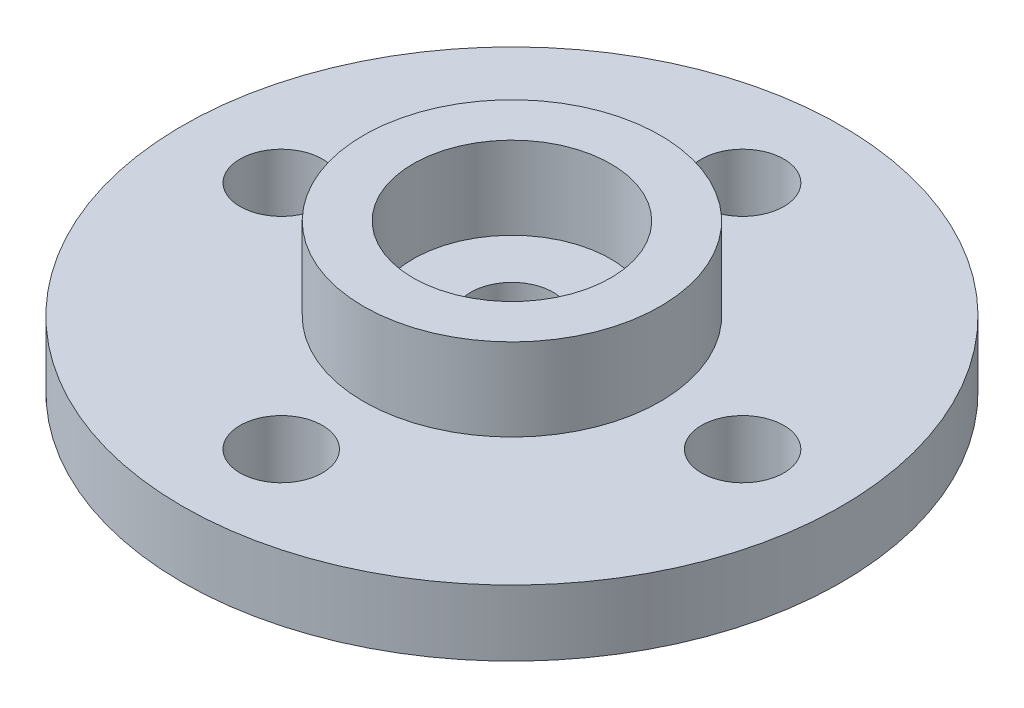
ISO-10303-21;
HEADER;
FILE_DESCRIPTION(('STEP AP214'),'2;1');
FILE_NAME('part.step','',(''),(''),'','','');
FILE_SCHEMA(('AUTOMOTIVE_DESIGN { 1 0 10303 214 1 1 1 1 }'));
ENDSEC;
DATA;
#1=APPLICATION_CONTEXT('core data for automotive mechanical design processes');
#2=APPLICATION_PROTOCOL_DEFINITION('international standard','automotive_design',2000,#1);
#3=PRODUCT_CONTEXT('',#1,'mechanical');
#4=PRODUCT('Part','Part','',(#3));
#5=PRODUCT_RELATED_PRODUCT_CATEGORY('part','',(#4));
#6=PRODUCT_DEFINITION_FORMATION('','',#4);
#7=PRODUCT_DEFINITION_CONTEXT('part definition',#1,'design');
#8=PRODUCT_DEFINITION('design','',#6,#7);
#9=PRODUCT_DEFINITION_SHAPE('','',#8);
#10=(LENGTH_UNIT() NAMED_UNIT(*) SI_UNIT(.MILLI.,.METRE.));
#11=(NAMED_UNIT(*) PLANE_ANGLE_UNIT() SI_UNIT($,.RADIAN.));
#12=(NAMED_UNIT(*) SI_UNIT($,.STERADIAN.) SOLID_ANGLE_UNIT());
#13=UNCERTAINTY_MEASURE_WITH_UNIT(LENGTH_MEASURE(1.E-05),#10,'distance_accuracy_value','');
#14=(GEOMETRIC_REPRESENTATION_CONTEXT(3) GLOBAL_UNCERTAINTY_ASSIGNED_CONTEXT((#13)) GLOBAL_UNIT_ASSIGNED_CONTEXT((#10,
#11,#12)) REPRESENTATION_CONTEXT('',''));
#15=CARTESIAN_POINT('',(0.,0.,0.));
#16=DIRECTION('',(0.,0.,1.));
#17=DIRECTION('',(1.,0.,0.));
#18=AXIS2_PLACEMENT_3D('',#15,#16,#17);
#19=CARTESIAN_POINT('',(0.,2.,0.));
#20=DIRECTION('',(0.,1.,0.));
#21=DIRECTION('',(0.,0.,1.));
#22=AXIS2_PLACEMENT_3D('',#19,#20,#21);
#23=PLANE('',#22);
#24=CARTESIAN_POINT('',(-7.,2.,0.));
#25=DIRECTION('',(0.,1.,0.));
#26=DIRECTION('',(0.,0.,1.));
#27=AXIS2_PLACEMENT_3D('',#24,#25,#26);
#28=CIRCLE('',#27,1.25);
#29=CARTESIAN_POINT('',(-7.,2.,1.24999999999995));
#30=VERTEX_POINT('',#29);
#31=EDGE_CURVE('E65',#30,#30,#28,.T.);
#32=ORIENTED_EDGE('',*,*,#31,.F.);
#33=EDGE_LOOP('',(#32));
#34=FACE_BOUND('',#33,.T.);
#35=CARTESIAN_POINT('',(0.,2.,0.));
#36=DIRECTION('',(0.,1.,0.));
#37=DIRECTION('',(0.,0.,1.));
#38=AXIS2_PLACEMENT_3D('',#35,#36,#37);
#39=CIRCLE('',#38,10.);
#40=CARTESIAN_POINT('',(0.,2.,10.));
#41=VERTEX_POINT('',#40);
#42=EDGE_CURVE('E39',#41,#41,#39,.T.);
#43=ORIENTED_EDGE('',*,*,#42,.T.);
#44=EDGE_LOOP('',(#43));
#45=FACE_BOUND('',#44,.T.);
#46=CARTESIAN_POINT('',(7.,2.,0.));
#47=DIRECTION('',(0.,1.,0.));
#48=DIRECTION('',(0.,0.,1.));
#49=AXIS2_PLACEMENT_3D('',#46,#47,#48);
#50=CIRCLE('',#49,1.25);
#51=CARTESIAN_POINT('',(7.,2.,1.25));
#52=VERTEX_POINT('',#51);
#53=EDGE_CURVE('E48',#52,#52,#50,.T.);
#54=ORIENTED_EDGE('',*,*,#53,.F.);
#55=EDGE_LOOP('',(#54));
#56=FACE_BOUND('',#55,.T.);
#57=CARTESIAN_POINT('',(0.,2.,7.));
#58=DIRECTION('',(0.,1.,0.));
#59=DIRECTION('',(0.,0.,1.));
#60=AXIS2_PLACEMENT_3D('',#57,#58,#59);
#61=CIRCLE('',#60,1.25);
#62=CARTESIAN_POINT('',(0.,2.,8.25));
#63=VERTEX_POINT('',#62);
#64=EDGE_CURVE('E59',#63,#63,#61,.T.);
#65=ORIENTED_EDGE('',*,*,#64,.F.);
#66=EDGE_LOOP('',(#65));
#67=FACE_BOUND('',#66,.T.);
#68=CARTESIAN_POINT('',(0.,2.,-7.));
#69=DIRECTION('',(0.,1.,0.));
#70=DIRECTION('',(0.,0.,1.));
#71=AXIS2_PLACEMENT_3D('',#68,#69,#70);
#72=CIRCLE('',#71,1.25);
#73=CARTESIAN_POINT('',(0.,2.,-5.75));
#74=VERTEX_POINT('',#73);
#75=EDGE_CURVE('E71',#74,#74,#72,.T.);
#76=ORIENTED_EDGE('',*,*,#75,.F.);
#77=EDGE_LOOP('',(#76));
#78=FACE_BOUND('',#77,.T.);
#79=CARTESIAN_POINT('',(0.,2.,0.));
#80=DIRECTION('',(0.,1.,0.));
#81=DIRECTION('',(0.,0.,1.));
#82=AXIS2_PLACEMENT_3D('',#79,#80,#81);
#83=CIRCLE('',#82,4.5);
#84=CARTESIAN_POINT('',(0.,2.,4.5));
#85=VERTEX_POINT('',#84);
#86=EDGE_CURVE('E80',#85,#85,#83,.T.);
#87=ORIENTED_EDGE('',*,*,#86,.F.);
#88=EDGE_LOOP('',(#87));
#89=FACE_BOUND('',#88,.T.);
#90=ADVANCED_FACE('F32',(#34,#45,#56,#67,#78,#89),#23,.T.);
#91=CARTESIAN_POINT('',(0.,2.,0.));
#92=DIRECTION('',(0.,1.,0.));
#93=DIRECTION('',(0.,0.,1.));
#94=AXIS2_PLACEMENT_3D('',#91,#92,#93);
#95=CIRCLE('',#94,3.);
#96=CARTESIAN_POINT('',(0.,2.,3.));
#97=VERTEX_POINT('',#96);
#98=EDGE_CURVE('E10',#97,#97,#95,.F.);
#99=ORIENTED_EDGE('',*,*,#98,.F.);
#100=EDGE_LOOP('',(#99));
#101=FACE_BOUND('',#100,.T.);
#102=CARTESIAN_POINT('',(0.,2.,0.));
#103=DIRECTION('',(0.,1.,0.));
#104=DIRECTION('',(0.,0.,1.));
#105=AXIS2_PLACEMENT_3D('',#102,#103,#104);
#106=CIRCLE('',#105,1.25);
#107=CARTESIAN_POINT('',(0.,2.,1.25));
#108=VERTEX_POINT('',#107);
#109=EDGE_CURVE('E53',#108,#108,#106,.T.);
#110=ORIENTED_EDGE('',*,*,#109,.F.);
#111=EDGE_LOOP('',(#110));
#112=FACE_BOUND('',#111,.T.);
#113=ADVANCED_FACE('F108',(#101,#112),#23,.T.);
#114=CARTESIAN_POINT('',(0.,0.,0.));
#115=DIRECTION('',(0.,1.,0.));
#116=DIRECTION('',(0.,0.,1.));
#117=AXIS2_PLACEMENT_3D('',#114,#115,#116);
#118=PLANE('',#117);
#119=CARTESIAN_POINT('',(-7.,0.,0.));
#120=DIRECTION('',(0.,1.,0.));
#121=DIRECTION('',(0.,0.,1.));
#122=AXIS2_PLACEMENT_3D('',#119,#120,#121);
#123=CIRCLE('',#122,1.25);
#124=CARTESIAN_POINT('',(-7.,0.,1.24999999999995));
#125=VERTEX_POINT('',#124);
#126=EDGE_CURVE('E68',#125,#125,#123,.T.);
#127=ORIENTED_EDGE('',*,*,#126,.T.);
#128=EDGE_LOOP('',(#127));
#129=FACE_BOUND('',#128,.T.);
#130=CARTESIAN_POINT('',(0.,0.,0.));
#131=DIRECTION('',(0.,1.,0.));
#132=DIRECTION('',(0.,0.,1.));
#133=AXIS2_PLACEMENT_3D('',#130,#131,#132);
#134=CIRCLE('',#133,1.25);
#135=CARTESIAN_POINT('',(0.,0.,1.25));
#136=VERTEX_POINT('',#135);
#137=EDGE_CURVE('E56',#136,#136,#134,.T.);
#138=ORIENTED_EDGE('',*,*,#137,.T.);
#139=EDGE_LOOP('',(#138));
#140=FACE_BOUND('',#139,.T.);
#141=CARTESIAN_POINT('',(0.,0.,0.));
#142=DIRECTION('',(0.,1.,0.));
#143=DIRECTION('',(0.,0.,1.));
#144=AXIS2_PLACEMENT_3D('',#141,#142,#143);
#145=CIRCLE('',#144,10.);
#146=CARTESIAN_POINT('',(0.,0.,10.));
#147=VERTEX_POINT('',#146);
#148=EDGE_CURVE('E43',#147,#147,#145,.T.);
#149=ORIENTED_EDGE('',*,*,#148,.F.);
#150=EDGE_LOOP('',(#149));
#151=FACE_BOUND('',#150,.T.);
#152=CARTESIAN_POINT('',(7.,0.,0.));
#153=DIRECTION('',(0.,1.,0.));
#154=DIRECTION('',(0.,0.,1.));
#155=AXIS2_PLACEMENT_3D('',#152,#153,#154);
#156=CIRCLE('',#155,1.25);
#157=CARTESIAN_POINT('',(7.,0.,1.25));
#158=VERTEX_POINT('',#157);
#159=EDGE_CURVE('E50',#158,#158,#156,.T.);
#160=ORIENTED_EDGE('',*,*,#159,.T.);
#161=EDGE_LOOP('',(#160));
#162=FACE_BOUND('',#161,.T.);
#163=CARTESIAN_POINT('',(0.,0.,7.));
#164=DIRECTION('',(0.,1.,0.));
#165=DIRECTION('',(0.,0.,1.));
#166=AXIS2_PLACEMENT_3D('',#163,#164,#165);
#167=CIRCLE('',#166,1.25);
#168=CARTESIAN_POINT('',(0.,0.,8.25));
#169=VERTEX_POINT('',#168);
#170=EDGE_CURVE('E62',#169,#169,#167,.T.);
#171=ORIENTED_EDGE('',*,*,#170,.T.);
#172=EDGE_LOOP('',(#171));
#173=FACE_BOUND('',#172,.T.);
#174=CARTESIAN_POINT('',(0.,0.,-7.));
#175=DIRECTION('',(0.,1.,0.));
#176=DIRECTION('',(0.,0.,1.));
#177=AXIS2_PLACEMENT_3D('',#174,#175,#176);
#178=CIRCLE('',#177,1.25);
#179=CARTESIAN_POINT('',(0.,0.,-5.75));
#180=VERTEX_POINT('',#179);
#181=EDGE_CURVE('E74',#180,#180,#178,.T.);
#182=ORIENTED_EDGE('',*,*,#181,.T.);
#183=EDGE_LOOP('',(#182));
#184=FACE_BOUND('',#183,.T.);
#185=ADVANCED_FACE('F114',(#129,#140,#151,#162,#173,#184),#118,.F.);
#186=CARTESIAN_POINT('',(0.,2.,0.));
#187=DIRECTION('',(0.,-1.,0.));
#188=DIRECTION('',(0.,0.,-1.));
#189=AXIS2_PLACEMENT_3D('',#186,#187,#188);
#190=CYLINDRICAL_SURFACE('',#189,10.);
#191=ORIENTED_EDGE('',*,*,#42,.F.);
#192=EDGE_LOOP('',(#191));
#193=FACE_BOUND('',#192,.T.);
#194=ORIENTED_EDGE('',*,*,#148,.T.);
#195=EDGE_LOOP('',(#194));
#196=FACE_BOUND('',#195,.T.);
#197=ADVANCED_FACE('F34',(#193,#196),#190,.T.);
#198=CARTESIAN_POINT('',(7.,2.,0.));
#199=DIRECTION('',(0.,-1.,0.));
#200=DIRECTION('',(0.,0.,-1.));
#201=AXIS2_PLACEMENT_3D('',#198,#199,#200);
#202=CYLINDRICAL_SURFACE('',#201,1.25);
#203=ORIENTED_EDGE('',*,*,#53,.T.);
#204=EDGE_LOOP('',(#203));
#205=FACE_BOUND('',#204,.T.);
#206=ORIENTED_EDGE('',*,*,#159,.F.);
#207=EDGE_LOOP('',(#206));
#208=FACE_BOUND('',#207,.T.);
#209=ADVANCED_FACE('F118',(#205,#208),#202,.F.);
#210=CARTESIAN_POINT('',(0.,2.,0.));
#211=DIRECTION('',(0.,-1.,0.));
#212=DIRECTION('',(0.,0.,-1.));
#213=AXIS2_PLACEMENT_3D('',#210,#211,#212);
#214=CYLINDRICAL_SURFACE('',#213,1.25);
#215=ORIENTED_EDGE('',*,*,#109,.T.);
#216=EDGE_LOOP('',(#215));
#217=FACE_BOUND('',#216,.T.);
#218=ORIENTED_EDGE('',*,*,#137,.F.);
#219=EDGE_LOOP('',(#218));
#220=FACE_BOUND('',#219,.T.);
#221=ADVANCED_FACE('F141',(#217,#220),#214,.F.);
#222=CARTESIAN_POINT('',(0.,2.,7.));
#223=DIRECTION('',(0.,-1.,0.));
#224=DIRECTION('',(0.,0.,-1.));
#225=AXIS2_PLACEMENT_3D('',#222,#223,#224);
#226=CYLINDRICAL_SURFACE('',#225,1.25);
#227=ORIENTED_EDGE('',*,*,#64,.T.);
#228=EDGE_LOOP('',(#227));
#229=FACE_BOUND('',#228,.T.);
#230=ORIENTED_EDGE('',*,*,#170,.F.);
#231=EDGE_LOOP('',(#230));
#232=FACE_BOUND('',#231,.T.);
#233=ADVANCED_FACE('F139',(#229,#232),#226,.F.);
#234=CARTESIAN_POINT('',(-7.,2.,0.));
#235=DIRECTION('',(0.,-1.,0.));
#236=DIRECTION('',(0.,0.,-1.));
#237=AXIS2_PLACEMENT_3D('',#234,#235,#236);
#238=CYLINDRICAL_SURFACE('',#237,1.25);
#239=ORIENTED_EDGE('',*,*,#31,.T.);
#240=EDGE_LOOP('',(#239));
#241=FACE_BOUND('',#240,.T.);
#242=ORIENTED_EDGE('',*,*,#126,.F.);
#243=EDGE_LOOP('',(#242));
#244=FACE_BOUND('',#243,.T.);
#245=ADVANCED_FACE('F103',(#241,#244),#238,.F.);
#246=CARTESIAN_POINT('',(0.,2.,-7.));
#247=DIRECTION('',(0.,-1.,0.));
#248=DIRECTION('',(0.,0.,-1.));
#249=AXIS2_PLACEMENT_3D('',#246,#247,#248);
#250=CYLINDRICAL_SURFACE('',#249,1.25);
#251=ORIENTED_EDGE('',*,*,#75,.T.);
#252=EDGE_LOOP('',(#251));
#253=FACE_BOUND('',#252,.T.);
#254=ORIENTED_EDGE('',*,*,#181,.F.);
#255=EDGE_LOOP('',(#254));
#256=FACE_BOUND('',#255,.T.);
#257=ADVANCED_FACE('F94',(#253,#256),#250,.F.);
#258=CARTESIAN_POINT('',(0.,4.5,0.));
#259=DIRECTION('',(0.,1.,0.));
#260=DIRECTION('',(0.,0.,1.));
#261=AXIS2_PLACEMENT_3D('',#258,#259,#260);
#262=PLANE('',#261);
#263=CARTESIAN_POINT('',(0.,4.5,0.));
#264=DIRECTION('',(0.,1.,0.));
#265=DIRECTION('',(0.,0.,1.));
#266=AXIS2_PLACEMENT_3D('',#263,#264,#265);
#267=CIRCLE('',#266,4.5);
#268=CARTESIAN_POINT('',(0.,4.5,4.5));
#269=VERTEX_POINT('',#268);
#270=EDGE_CURVE('E77',#269,#269,#267,.T.);
#271=ORIENTED_EDGE('',*,*,#270,.T.);
#272=EDGE_LOOP('',(#271));
#273=FACE_BOUND('',#272,.T.);
#274=CARTESIAN_POINT('',(0.,4.5,0.));
#275=DIRECTION('',(0.,1.,0.));
#276=DIRECTION('',(0.,0.,1.));
#277=AXIS2_PLACEMENT_3D('',#274,#275,#276);
#278=CIRCLE('',#277,3.);
#279=CARTESIAN_POINT('',(0.,4.5,3.));
#280=VERTEX_POINT('',#279);
#281=EDGE_CURVE('E83',#280,#280,#278,.T.);
#282=ORIENTED_EDGE('',*,*,#281,.F.);
#283=EDGE_LOOP('',(#282));
#284=FACE_BOUND('',#283,.T.);
#285=ADVANCED_FACE('F91',(#273,#284),#262,.T.);
#286=CARTESIAN_POINT('',(0.,4.5,0.));
#287=DIRECTION('',(0.,-1.,0.));
#288=DIRECTION('',(0.,0.,-1.));
#289=AXIS2_PLACEMENT_3D('',#286,#287,#288);
#290=CYLINDRICAL_SURFACE('',#289,4.5);
#291=ORIENTED_EDGE('',*,*,#270,.F.);
#292=EDGE_LOOP('',(#291));
#293=FACE_BOUND('',#292,.T.);
#294=ORIENTED_EDGE('',*,*,#86,.T.);
#295=EDGE_LOOP('',(#294));
#296=FACE_BOUND('',#295,.T.);
#297=ADVANCED_FACE('F93',(#293,#296),#290,.T.);
#298=CARTESIAN_POINT('',(0.,4.5,0.));
#299=DIRECTION('',(0.,-1.,0.));
#300=DIRECTION('',(0.,0.,-1.));
#301=AXIS2_PLACEMENT_3D('',#298,#299,#300);
#302=CYLINDRICAL_SURFACE('',#301,3.);
#303=ORIENTED_EDGE('',*,*,#281,.T.);
#304=EDGE_LOOP('',(#303));
#305=FACE_BOUND('',#304,.T.);
#306=ORIENTED_EDGE('',*,*,#98,.T.);
#307=EDGE_LOOP('',(#306));
#308=FACE_BOUND('',#307,.T.);
#309=ADVANCED_FACE('F89',(#305,#308),#302,.F.);
#310=CLOSED_SHELL('',(#90,#113,#185,#197,#209,#221,#233,#245,#257,#285,#297,#309));
#311=MANIFOLD_SOLID_BREP('B2',#310);
#312=ADVANCED_BREP_SHAPE_REPRESENTATION('',(#18,#311),#14);
#313=SHAPE_DEFINITION_REPRESENTATION(#9,#312);
ENDSEC;
END-ISO-10303-21;
